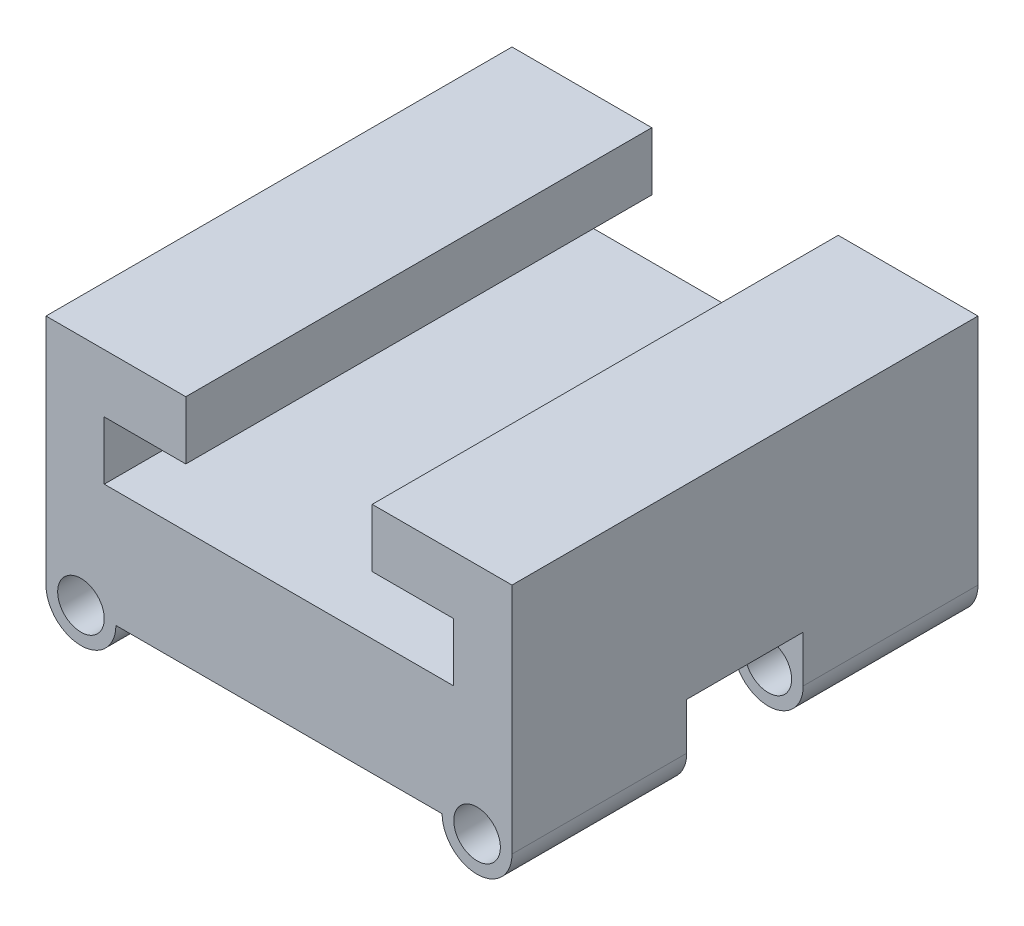
ISO-10303-21;
HEADER;
FILE_DESCRIPTION(('STEP AP214'),'2;1');
FILE_NAME('part.step','',(''),(''),'','','');
FILE_SCHEMA(('AUTOMOTIVE_DESIGN { 1 0 10303 214 1 1 1 1 }'));
ENDSEC;
DATA;
#1=APPLICATION_CONTEXT('core data for automotive mechanical design processes');
#2=APPLICATION_PROTOCOL_DEFINITION('international standard','automotive_design',2000,#1);
#3=PRODUCT_CONTEXT('',#1,'mechanical');
#4=PRODUCT('Part','Part','',(#3));
#5=PRODUCT_RELATED_PRODUCT_CATEGORY('part','',(#4));
#6=PRODUCT_DEFINITION_FORMATION('','',#4);
#7=PRODUCT_DEFINITION_CONTEXT('part definition',#1,'design');
#8=PRODUCT_DEFINITION('design','',#6,#7);
#9=PRODUCT_DEFINITION_SHAPE('','',#8);
#10=(LENGTH_UNIT() NAMED_UNIT(*) SI_UNIT(.MILLI.,.METRE.));
#11=(NAMED_UNIT(*) PLANE_ANGLE_UNIT() SI_UNIT($,.RADIAN.));
#12=(NAMED_UNIT(*) SI_UNIT($,.STERADIAN.) SOLID_ANGLE_UNIT());
#13=UNCERTAINTY_MEASURE_WITH_UNIT(LENGTH_MEASURE(1.E-05),#10,'distance_accuracy_value','');
#14=(GEOMETRIC_REPRESENTATION_CONTEXT(3) GLOBAL_UNCERTAINTY_ASSIGNED_CONTEXT((#13)) GLOBAL_UNIT_ASSIGNED_CONTEXT((#10,
#11,#12)) REPRESENTATION_CONTEXT('',''));
#15=CARTESIAN_POINT('',(0.,0.,0.));
#16=DIRECTION('',(0.,0.,1.));
#17=DIRECTION('',(1.,0.,0.));
#18=AXIS2_PLACEMENT_3D('',#15,#16,#17);
#19=CARTESIAN_POINT('',(20.,0.,40.));
#20=DIRECTION('',(0.,-1.,0.));
#21=DIRECTION('',(1.,0.,0.));
#22=AXIS2_PLACEMENT_3D('',#19,#20,#21);
#23=PLANE('',#22);
#24=DIRECTION('',(0.,0.,1.));
#25=VECTOR('',#24,1.);
#26=CARTESIAN_POINT('',(13.,0.,3.68629150101524));
#27=LINE('',#26,#25);
#28=CARTESIAN_POINT('',(13.,0.,15.));
#29=VERTEX_POINT('',#28);
#30=CARTESIAN_POINT('',(13.,0.,25.));
#31=VERTEX_POINT('',#30);
#32=EDGE_CURVE('E220',#29,#31,#27,.T.);
#33=ORIENTED_EDGE('',*,*,#32,.T.);
#34=DIRECTION('',(1.,0.,0.));
#35=VECTOR('',#34,1.);
#36=CARTESIAN_POINT('',(20.,0.,25.));
#37=LINE('',#36,#35);
#38=CARTESIAN_POINT('',(14.,0.,25.));
#39=VERTEX_POINT('',#38);
#40=EDGE_CURVE('E190',#31,#39,#37,.T.);
#41=ORIENTED_EDGE('',*,*,#40,.T.);
#42=DIRECTION('',(0.,0.,1.));
#43=VECTOR('',#42,1.);
#44=CARTESIAN_POINT('',(14.,0.,25.));
#45=LINE('',#44,#43);
#46=CARTESIAN_POINT('',(14.,0.,40.));
#47=VERTEX_POINT('',#46);
#48=EDGE_CURVE('E239',#39,#47,#45,.T.);
#49=ORIENTED_EDGE('',*,*,#48,.T.);
#50=DIRECTION('',(-1.,0.,0.));
#51=VECTOR('',#50,1.);
#52=CARTESIAN_POINT('',(20.,0.,40.));
#53=LINE('',#52,#51);
#54=CARTESIAN_POINT('',(-14.,0.,40.));
#55=VERTEX_POINT('',#54);
#56=EDGE_CURVE('E62',#47,#55,#53,.T.);
#57=ORIENTED_EDGE('',*,*,#56,.T.);
#58=DIRECTION('',(0.,0.,-1.));
#59=VECTOR('',#58,1.);
#60=CARTESIAN_POINT('',(-14.,0.,48.4852813742386));
#61=LINE('',#60,#59);
#62=CARTESIAN_POINT('',(-14.,0.,0.));
#63=VERTEX_POINT('',#62);
#64=EDGE_CURVE('E66',#63,#55,#61,.F.);
#65=ORIENTED_EDGE('',*,*,#64,.F.);
#66=DIRECTION('',(-1.,0.,0.));
#67=VECTOR('',#66,1.);
#68=CARTESIAN_POINT('',(20.,0.,0.));
#69=LINE('',#68,#67);
#70=CARTESIAN_POINT('',(14.,0.,0.));
#71=VERTEX_POINT('',#70);
#72=EDGE_CURVE('E316',#71,#63,#69,.T.);
#73=ORIENTED_EDGE('',*,*,#72,.F.);
#74=DIRECTION('',(0.,0.,-1.));
#75=VECTOR('',#74,1.);
#76=CARTESIAN_POINT('',(14.,0.,15.));
#77=LINE('',#76,#75);
#78=CARTESIAN_POINT('',(14.,0.,15.));
#79=VERTEX_POINT('',#78);
#80=EDGE_CURVE('E248',#79,#71,#77,.T.);
#81=ORIENTED_EDGE('',*,*,#80,.F.);
#82=DIRECTION('',(1.,0.,0.));
#83=VECTOR('',#82,1.);
#84=CARTESIAN_POINT('',(20.,0.,15.));
#85=LINE('',#84,#83);
#86=EDGE_CURVE('E189',#29,#79,#85,.T.);
#87=ORIENTED_EDGE('',*,*,#86,.F.);
#88=EDGE_LOOP('',(#33,#41,#49,#57,#65,#73,#81,#87));
#89=FACE_BOUND('',#88,.T.);
#90=ADVANCED_FACE('F44',(#89),#23,.T.);
#91=CARTESIAN_POINT('',(20.,20.,40.));
#92=DIRECTION('',(1.,0.,0.));
#93=DIRECTION('',(0.,1.,0.));
#94=AXIS2_PLACEMENT_3D('',#91,#92,#93);
#95=PLANE('',#94);
#96=DIRECTION('',(0.,0.,-1.));
#97=VECTOR('',#96,1.);
#98=CARTESIAN_POINT('',(20.,0.,40.));
#99=LINE('',#98,#97);
#100=CARTESIAN_POINT('',(20.,0.,40.));
#101=VERTEX_POINT('',#100);
#102=CARTESIAN_POINT('',(20.,0.,25.));
#103=VERTEX_POINT('',#102);
#104=EDGE_CURVE('E374',#101,#103,#99,.T.);
#105=ORIENTED_EDGE('',*,*,#104,.T.);
#106=DIRECTION('',(0.,-1.,0.));
#107=VECTOR('',#106,1.);
#108=CARTESIAN_POINT('',(20.,4.,25.));
#109=LINE('',#108,#107);
#110=CARTESIAN_POINT('',(20.,4.,25.));
#111=VERTEX_POINT('',#110);
#112=EDGE_CURVE('E205',#111,#103,#109,.T.);
#113=ORIENTED_EDGE('',*,*,#112,.F.);
#114=DIRECTION('',(0.,0.,1.));
#115=VECTOR('',#114,1.);
#116=CARTESIAN_POINT('',(20.,4.,3.68629150101524));
#117=LINE('',#116,#115);
#118=CARTESIAN_POINT('',(20.,4.,15.));
#119=VERTEX_POINT('',#118);
#120=EDGE_CURVE('E195',#119,#111,#117,.T.);
#121=ORIENTED_EDGE('',*,*,#120,.F.);
#122=DIRECTION('',(0.,1.,0.));
#123=VECTOR('',#122,1.);
#124=CARTESIAN_POINT('',(20.,20.,15.));
#125=LINE('',#124,#123);
#126=CARTESIAN_POINT('',(20.,0.,15.));
#127=VERTEX_POINT('',#126);
#128=EDGE_CURVE('E176',#127,#119,#125,.T.);
#129=ORIENTED_EDGE('',*,*,#128,.F.);
#130=DIRECTION('',(0.,0.,-1.));
#131=VECTOR('',#130,1.);
#132=CARTESIAN_POINT('',(20.,0.,15.));
#133=LINE('',#132,#131);
#134=CARTESIAN_POINT('',(20.,0.,0.));
#135=VERTEX_POINT('',#134);
#136=EDGE_CURVE('E251',#127,#135,#133,.T.);
#137=ORIENTED_EDGE('',*,*,#136,.T.);
#138=DIRECTION('',(0.,-1.,0.));
#139=VECTOR('',#138,1.);
#140=CARTESIAN_POINT('',(20.,20.,0.));
#141=LINE('',#140,#139);
#142=CARTESIAN_POINT('',(20.,20.,0.));
#143=VERTEX_POINT('',#142);
#144=EDGE_CURVE('E312',#143,#135,#141,.T.);
#145=ORIENTED_EDGE('',*,*,#144,.F.);
#146=DIRECTION('',(0.,0.,-1.));
#147=VECTOR('',#146,1.);
#148=CARTESIAN_POINT('',(20.,20.,40.));
#149=LINE('',#148,#147);
#150=CARTESIAN_POINT('',(20.,20.,40.));
#151=VERTEX_POINT('',#150);
#152=EDGE_CURVE('E377',#151,#143,#149,.T.);
#153=ORIENTED_EDGE('',*,*,#152,.F.);
#154=DIRECTION('',(0.,-1.,0.));
#155=VECTOR('',#154,1.);
#156=CARTESIAN_POINT('',(20.,20.,40.));
#157=LINE('',#156,#155);
#158=EDGE_CURVE('E267',#151,#101,#157,.T.);
#159=ORIENTED_EDGE('',*,*,#158,.T.);
#160=EDGE_LOOP('',(#105,#113,#121,#129,#137,#145,#153,#159));
#161=FACE_BOUND('',#160,.T.);
#162=ADVANCED_FACE('F204',(#161),#95,.T.);
#163=CARTESIAN_POINT('',(7.99999999999999,15.,40.));
#164=DIRECTION('',(-1.,0.,0.));
#165=DIRECTION('',(0.,0.,1.));
#166=AXIS2_PLACEMENT_3D('',#163,#164,#165);
#167=PLANE('',#166);
#168=DIRECTION('',(0.,1.,0.));
#169=VECTOR('',#168,1.);
#170=CARTESIAN_POINT('',(7.99999999999999,15.,0.));
#171=LINE('',#170,#169);
#172=CARTESIAN_POINT('',(7.99999999999999,15.,0.));
#173=VERTEX_POINT('',#172);
#174=CARTESIAN_POINT('',(7.99999999999999,20.,0.));
#175=VERTEX_POINT('',#174);
#176=EDGE_CURVE('E254',#173,#175,#171,.T.);
#177=ORIENTED_EDGE('',*,*,#176,.F.);
#178=DIRECTION('',(0.,0.,-1.));
#179=VECTOR('',#178,1.);
#180=CARTESIAN_POINT('',(7.99999999999999,15.,40.));
#181=LINE('',#180,#179);
#182=CARTESIAN_POINT('',(7.99999999999999,15.,40.));
#183=VERTEX_POINT('',#182);
#184=EDGE_CURVE('E11',#183,#173,#181,.T.);
#185=ORIENTED_EDGE('',*,*,#184,.F.);
#186=DIRECTION('',(0.,1.,0.));
#187=VECTOR('',#186,1.);
#188=CARTESIAN_POINT('',(7.99999999999999,15.,40.));
#189=LINE('',#188,#187);
#190=CARTESIAN_POINT('',(7.99999999999999,20.,40.));
#191=VERTEX_POINT('',#190);
#192=EDGE_CURVE('E258',#183,#191,#189,.T.);
#193=ORIENTED_EDGE('',*,*,#192,.T.);
#194=DIRECTION('',(0.,0.,-1.));
#195=VECTOR('',#194,1.);
#196=CARTESIAN_POINT('',(7.99999999999999,20.,40.));
#197=LINE('',#196,#195);
#198=EDGE_CURVE('E304',#191,#175,#197,.T.);
#199=ORIENTED_EDGE('',*,*,#198,.T.);
#200=EDGE_LOOP('',(#177,#185,#193,#199));
#201=FACE_BOUND('',#200,.T.);
#202=ADVANCED_FACE('F46',(#201),#167,.T.);
#203=CARTESIAN_POINT('',(15.,15.,40.));
#204=DIRECTION('',(0.,-1.,0.));
#205=DIRECTION('',(0.,0.,-1.));
#206=AXIS2_PLACEMENT_3D('',#203,#204,#205);
#207=PLANE('',#206);
#208=DIRECTION('',(-1.,0.,0.));
#209=VECTOR('',#208,1.);
#210=CARTESIAN_POINT('',(15.,15.,0.));
#211=LINE('',#210,#209);
#212=CARTESIAN_POINT('',(15.,15.,0.));
#213=VERTEX_POINT('',#212);
#214=EDGE_CURVE('E263',#213,#173,#211,.T.);
#215=ORIENTED_EDGE('',*,*,#214,.F.);
#216=DIRECTION('',(0.,0.,-1.));
#217=VECTOR('',#216,1.);
#218=CARTESIAN_POINT('',(15.,15.,40.));
#219=LINE('',#218,#217);
#220=CARTESIAN_POINT('',(15.,15.,40.));
#221=VERTEX_POINT('',#220);
#222=EDGE_CURVE('E54',#221,#213,#219,.T.);
#223=ORIENTED_EDGE('',*,*,#222,.F.);
#224=DIRECTION('',(-1.,0.,0.));
#225=VECTOR('',#224,1.);
#226=CARTESIAN_POINT('',(15.,15.,40.));
#227=LINE('',#226,#225);
#228=EDGE_CURVE('E300',#221,#183,#227,.T.);
#229=ORIENTED_EDGE('',*,*,#228,.T.);
#230=ORIENTED_EDGE('',*,*,#184,.T.);
#231=EDGE_LOOP('',(#215,#223,#229,#230));
#232=FACE_BOUND('',#231,.T.);
#233=ADVANCED_FACE('F393',(#232),#207,.T.);
#234=CARTESIAN_POINT('',(15.,9.99999999999999,40.));
#235=DIRECTION('',(-1.,0.,0.));
#236=DIRECTION('',(0.,-1.,0.));
#237=AXIS2_PLACEMENT_3D('',#234,#235,#236);
#238=PLANE('',#237);
#239=DIRECTION('',(0.,1.,0.));
#240=VECTOR('',#239,1.);
#241=CARTESIAN_POINT('',(15.,9.99999999999999,0.));
#242=LINE('',#241,#240);
#243=CARTESIAN_POINT('',(15.,9.99999999999999,0.));
#244=VERTEX_POINT('',#243);
#245=EDGE_CURVE('E343',#244,#213,#242,.T.);
#246=ORIENTED_EDGE('',*,*,#245,.F.);
#247=DIRECTION('',(0.,0.,-1.));
#248=VECTOR('',#247,1.);
#249=CARTESIAN_POINT('',(15.,9.99999999999999,40.));
#250=LINE('',#249,#248);
#251=CARTESIAN_POINT('',(15.,9.99999999999999,40.));
#252=VERTEX_POINT('',#251);
#253=EDGE_CURVE('E352',#252,#244,#250,.T.);
#254=ORIENTED_EDGE('',*,*,#253,.F.);
#255=DIRECTION('',(0.,1.,0.));
#256=VECTOR('',#255,1.);
#257=CARTESIAN_POINT('',(15.,9.99999999999999,40.));
#258=LINE('',#257,#256);
#259=EDGE_CURVE('E296',#252,#221,#258,.T.);
#260=ORIENTED_EDGE('',*,*,#259,.T.);
#261=ORIENTED_EDGE('',*,*,#222,.T.);
#262=EDGE_LOOP('',(#246,#254,#260,#261));
#263=FACE_BOUND('',#262,.T.);
#264=ADVANCED_FACE('F514',(#263),#238,.T.);
#265=CARTESIAN_POINT('',(-15.,9.99999999999999,40.));
#266=DIRECTION('',(0.,1.,0.));
#267=DIRECTION('',(-1.,0.,0.));
#268=AXIS2_PLACEMENT_3D('',#265,#266,#267);
#269=PLANE('',#268);
#270=DIRECTION('',(1.,0.,0.));
#271=VECTOR('',#270,1.);
#272=CARTESIAN_POINT('',(-15.,9.99999999999999,0.));
#273=LINE('',#272,#271);
#274=CARTESIAN_POINT('',(-15.,9.99999999999999,0.));
#275=VERTEX_POINT('',#274);
#276=EDGE_CURVE('E339',#275,#244,#273,.T.);
#277=ORIENTED_EDGE('',*,*,#276,.F.);
#278=DIRECTION('',(0.,0.,-1.));
#279=VECTOR('',#278,1.);
#280=CARTESIAN_POINT('',(-15.,9.99999999999999,40.));
#281=LINE('',#280,#279);
#282=CARTESIAN_POINT('',(-15.,9.99999999999999,40.));
#283=VERTEX_POINT('',#282);
#284=EDGE_CURVE('E355',#283,#275,#281,.T.);
#285=ORIENTED_EDGE('',*,*,#284,.F.);
#286=DIRECTION('',(1.,0.,0.));
#287=VECTOR('',#286,1.);
#288=CARTESIAN_POINT('',(-15.,9.99999999999999,40.));
#289=LINE('',#288,#287);
#290=EDGE_CURVE('E292',#283,#252,#289,.T.);
#291=ORIENTED_EDGE('',*,*,#290,.T.);
#292=ORIENTED_EDGE('',*,*,#253,.T.);
#293=EDGE_LOOP('',(#277,#285,#291,#292));
#294=FACE_BOUND('',#293,.T.);
#295=ADVANCED_FACE('F511',(#294),#269,.T.);
#296=CARTESIAN_POINT('',(-15.,15.,40.));
#297=DIRECTION('',(1.,0.,0.));
#298=DIRECTION('',(0.,1.,0.));
#299=AXIS2_PLACEMENT_3D('',#296,#297,#298);
#300=PLANE('',#299);
#301=DIRECTION('',(0.,-1.,0.));
#302=VECTOR('',#301,1.);
#303=CARTESIAN_POINT('',(-15.,15.,0.));
#304=LINE('',#303,#302);
#305=CARTESIAN_POINT('',(-15.,15.,0.));
#306=VERTEX_POINT('',#305);
#307=EDGE_CURVE('E335',#306,#275,#304,.T.);
#308=ORIENTED_EDGE('',*,*,#307,.F.);
#309=DIRECTION('',(0.,0.,-1.));
#310=VECTOR('',#309,1.);
#311=CARTESIAN_POINT('',(-15.,15.,40.));
#312=LINE('',#311,#310);
#313=CARTESIAN_POINT('',(-15.,15.,40.));
#314=VERTEX_POINT('',#313);
#315=EDGE_CURVE('E358',#314,#306,#312,.T.);
#316=ORIENTED_EDGE('',*,*,#315,.F.);
#317=DIRECTION('',(0.,-1.,0.));
#318=VECTOR('',#317,1.);
#319=CARTESIAN_POINT('',(-15.,15.,40.));
#320=LINE('',#319,#318);
#321=EDGE_CURVE('E288',#314,#283,#320,.T.);
#322=ORIENTED_EDGE('',*,*,#321,.T.);
#323=ORIENTED_EDGE('',*,*,#284,.T.);
#324=EDGE_LOOP('',(#308,#316,#322,#323));
#325=FACE_BOUND('',#324,.T.);
#326=ADVANCED_FACE('F508',(#325),#300,.T.);
#327=CARTESIAN_POINT('',(-8.,15.,40.));
#328=DIRECTION('',(0.,-1.,0.));
#329=DIRECTION('',(1.,0.,0.));
#330=AXIS2_PLACEMENT_3D('',#327,#328,#329);
#331=PLANE('',#330);
#332=DIRECTION('',(-1.,0.,0.));
#333=VECTOR('',#332,1.);
#334=CARTESIAN_POINT('',(-8.,15.,0.));
#335=LINE('',#334,#333);
#336=CARTESIAN_POINT('',(-8.,15.,0.));
#337=VERTEX_POINT('',#336);
#338=EDGE_CURVE('E331',#337,#306,#335,.T.);
#339=ORIENTED_EDGE('',*,*,#338,.F.);
#340=DIRECTION('',(0.,0.,-1.));
#341=VECTOR('',#340,1.);
#342=CARTESIAN_POINT('',(-8.,15.,40.));
#343=LINE('',#342,#341);
#344=CARTESIAN_POINT('',(-8.,15.,40.));
#345=VERTEX_POINT('',#344);
#346=EDGE_CURVE('E361',#345,#337,#343,.T.);
#347=ORIENTED_EDGE('',*,*,#346,.F.);
#348=DIRECTION('',(-1.,0.,0.));
#349=VECTOR('',#348,1.);
#350=CARTESIAN_POINT('',(-8.,15.,40.));
#351=LINE('',#350,#349);
#352=EDGE_CURVE('E284',#345,#314,#351,.T.);
#353=ORIENTED_EDGE('',*,*,#352,.T.);
#354=ORIENTED_EDGE('',*,*,#315,.T.);
#355=EDGE_LOOP('',(#339,#347,#353,#354));
#356=FACE_BOUND('',#355,.T.);
#357=ADVANCED_FACE('F504',(#356),#331,.T.);
#358=CARTESIAN_POINT('',(-8.,20.,40.));
#359=DIRECTION('',(1.,0.,0.));
#360=DIRECTION('',(0.,0.,-1.));
#361=AXIS2_PLACEMENT_3D('',#358,#359,#360);
#362=PLANE('',#361);
#363=DIRECTION('',(0.,-1.,0.));
#364=VECTOR('',#363,1.);
#365=CARTESIAN_POINT('',(-8.,20.,0.));
#366=LINE('',#365,#364);
#367=CARTESIAN_POINT('',(-8.,20.,0.));
#368=VERTEX_POINT('',#367);
#369=EDGE_CURVE('E327',#368,#337,#366,.T.);
#370=ORIENTED_EDGE('',*,*,#369,.F.);
#371=DIRECTION('',(0.,0.,-1.));
#372=VECTOR('',#371,1.);
#373=CARTESIAN_POINT('',(-8.,20.,40.));
#374=LINE('',#373,#372);
#375=CARTESIAN_POINT('',(-8.,20.,40.));
#376=VERTEX_POINT('',#375);
#377=EDGE_CURVE('E364',#376,#368,#374,.T.);
#378=ORIENTED_EDGE('',*,*,#377,.F.);
#379=DIRECTION('',(0.,-1.,0.));
#380=VECTOR('',#379,1.);
#381=CARTESIAN_POINT('',(-8.,20.,40.));
#382=LINE('',#381,#380);
#383=EDGE_CURVE('E280',#376,#345,#382,.T.);
#384=ORIENTED_EDGE('',*,*,#383,.T.);
#385=ORIENTED_EDGE('',*,*,#346,.T.);
#386=EDGE_LOOP('',(#370,#378,#384,#385));
#387=FACE_BOUND('',#386,.T.);
#388=ADVANCED_FACE('F488',(#387),#362,.T.);
#389=CARTESIAN_POINT('',(-20.,20.,40.));
#390=DIRECTION('',(0.,1.,0.));
#391=DIRECTION('',(0.,0.,1.));
#392=AXIS2_PLACEMENT_3D('',#389,#390,#391);
#393=PLANE('',#392);
#394=DIRECTION('',(1.,0.,0.));
#395=VECTOR('',#394,1.);
#396=CARTESIAN_POINT('',(-20.,20.,0.));
#397=LINE('',#396,#395);
#398=CARTESIAN_POINT('',(-20.,20.,0.));
#399=VERTEX_POINT('',#398);
#400=EDGE_CURVE('E323',#399,#368,#397,.T.);
#401=ORIENTED_EDGE('',*,*,#400,.F.);
#402=DIRECTION('',(0.,0.,-1.));
#403=VECTOR('',#402,1.);
#404=CARTESIAN_POINT('',(-20.,20.,40.));
#405=LINE('',#404,#403);
#406=CARTESIAN_POINT('',(-20.,20.,40.));
#407=VERTEX_POINT('',#406);
#408=EDGE_CURVE('E367',#407,#399,#405,.T.);
#409=ORIENTED_EDGE('',*,*,#408,.F.);
#410=DIRECTION('',(1.,0.,0.));
#411=VECTOR('',#410,1.);
#412=CARTESIAN_POINT('',(-20.,20.,40.));
#413=LINE('',#412,#411);
#414=EDGE_CURVE('E276',#407,#376,#413,.T.);
#415=ORIENTED_EDGE('',*,*,#414,.T.);
#416=ORIENTED_EDGE('',*,*,#377,.T.);
#417=EDGE_LOOP('',(#401,#409,#415,#416));
#418=FACE_BOUND('',#417,.T.);
#419=ADVANCED_FACE('F484',(#418),#393,.T.);
#420=CARTESIAN_POINT('',(-20.,0.,40.));
#421=DIRECTION('',(-1.,0.,0.));
#422=DIRECTION('',(0.,-1.,0.));
#423=AXIS2_PLACEMENT_3D('',#420,#421,#422);
#424=PLANE('',#423);
#425=DIRECTION('',(0.,1.,0.));
#426=VECTOR('',#425,1.);
#427=CARTESIAN_POINT('',(-20.,0.,0.));
#428=LINE('',#427,#426);
#429=CARTESIAN_POINT('',(-20.,0.,0.));
#430=VERTEX_POINT('',#429);
#431=EDGE_CURVE('E319',#430,#399,#428,.T.);
#432=ORIENTED_EDGE('',*,*,#431,.F.);
#433=DIRECTION('',(0.,0.,-1.));
#434=VECTOR('',#433,1.);
#435=CARTESIAN_POINT('',(-20.,0.,40.));
#436=LINE('',#435,#434);
#437=CARTESIAN_POINT('',(-20.,0.,40.));
#438=VERTEX_POINT('',#437);
#439=EDGE_CURVE('E370',#438,#430,#436,.T.);
#440=ORIENTED_EDGE('',*,*,#439,.F.);
#441=DIRECTION('',(0.,1.,0.));
#442=VECTOR('',#441,1.);
#443=CARTESIAN_POINT('',(-20.,0.,40.));
#444=LINE('',#443,#442);
#445=EDGE_CURVE('E272',#438,#407,#444,.T.);
#446=ORIENTED_EDGE('',*,*,#445,.T.);
#447=ORIENTED_EDGE('',*,*,#408,.T.);
#448=EDGE_LOOP('',(#432,#440,#446,#447));
#449=FACE_BOUND('',#448,.T.);
#450=ADVANCED_FACE('F474',(#449),#424,.T.);
#451=CARTESIAN_POINT('',(7.99999999999999,20.,40.));
#452=DIRECTION('',(0.,1.,0.));
#453=DIRECTION('',(0.,0.,1.));
#454=AXIS2_PLACEMENT_3D('',#451,#452,#453);
#455=PLANE('',#454);
#456=DIRECTION('',(1.,0.,0.));
#457=VECTOR('',#456,1.);
#458=CARTESIAN_POINT('',(7.99999999999999,20.,0.));
#459=LINE('',#458,#457);
#460=EDGE_CURVE('E308',#175,#143,#459,.T.);
#461=ORIENTED_EDGE('',*,*,#460,.F.);
#462=ORIENTED_EDGE('',*,*,#198,.F.);
#463=DIRECTION('',(1.,0.,0.));
#464=VECTOR('',#463,1.);
#465=CARTESIAN_POINT('',(7.99999999999999,20.,40.));
#466=LINE('',#465,#464);
#467=EDGE_CURVE('E262',#191,#151,#466,.T.);
#468=ORIENTED_EDGE('',*,*,#467,.T.);
#469=ORIENTED_EDGE('',*,*,#152,.T.);
#470=EDGE_LOOP('',(#461,#462,#468,#469));
#471=FACE_BOUND('',#470,.T.);
#472=ADVANCED_FACE('F386',(#471),#455,.T.);
#473=CARTESIAN_POINT('',(0.,0.,40.));
#474=DIRECTION('',(0.,0.,-1.));
#475=DIRECTION('',(-1.,0.,0.));
#476=AXIS2_PLACEMENT_3D('',#473,#474,#475);
#477=PLANE('',#476);
#478=CARTESIAN_POINT('',(-17.,0.,40.));
#479=DIRECTION('',(0.,0.,-1.));
#480=DIRECTION('',(-1.,0.,0.));
#481=AXIS2_PLACEMENT_3D('',#478,#479,#480);
#482=CIRCLE('',#481,1.99999999999999);
#483=CARTESIAN_POINT('',(-19.,0.,40.));
#484=VERTEX_POINT('',#483);
#485=EDGE_CURVE('E429',#484,#484,#482,.T.);
#486=ORIENTED_EDGE('',*,*,#485,.T.);
#487=EDGE_LOOP('',(#486));
#488=FACE_BOUND('',#487,.T.);
#489=CARTESIAN_POINT('',(17.,0.,40.));
#490=DIRECTION('',(0.,0.,-1.));
#491=DIRECTION('',(-1.,0.,0.));
#492=AXIS2_PLACEMENT_3D('',#489,#490,#491);
#493=CIRCLE('',#492,1.99999999999999);
#494=CARTESIAN_POINT('',(15.,0.,40.));
#495=VERTEX_POINT('',#494);
#496=EDGE_CURVE('E422',#495,#495,#493,.T.);
#497=ORIENTED_EDGE('',*,*,#496,.T.);
#498=EDGE_LOOP('',(#497));
#499=FACE_BOUND('',#498,.T.);
#500=ORIENTED_EDGE('',*,*,#445,.F.);
#501=CARTESIAN_POINT('',(-17.,0.,40.));
#502=DIRECTION('',(0.,0.,-1.));
#503=DIRECTION('',(-1.,0.,0.));
#504=AXIS2_PLACEMENT_3D('',#501,#502,#503);
#505=CIRCLE('',#504,3.);
#506=EDGE_CURVE('E228',#438,#55,#505,.F.);
#507=ORIENTED_EDGE('',*,*,#506,.T.);
#508=ORIENTED_EDGE('',*,*,#56,.F.);
#509=CARTESIAN_POINT('',(17.,0.,40.));
#510=DIRECTION('',(0.,0.,-1.));
#511=DIRECTION('',(-1.,0.,0.));
#512=AXIS2_PLACEMENT_3D('',#509,#510,#511);
#513=CIRCLE('',#512,3.);
#514=EDGE_CURVE('E234',#101,#47,#513,.T.);
#515=ORIENTED_EDGE('',*,*,#514,.F.);
#516=ORIENTED_EDGE('',*,*,#158,.F.);
#517=ORIENTED_EDGE('',*,*,#467,.F.);
#518=ORIENTED_EDGE('',*,*,#192,.F.);
#519=ORIENTED_EDGE('',*,*,#228,.F.);
#520=ORIENTED_EDGE('',*,*,#259,.F.);
#521=ORIENTED_EDGE('',*,*,#290,.F.);
#522=ORIENTED_EDGE('',*,*,#321,.F.);
#523=ORIENTED_EDGE('',*,*,#352,.F.);
#524=ORIENTED_EDGE('',*,*,#383,.F.);
#525=ORIENTED_EDGE('',*,*,#414,.F.);
#526=EDGE_LOOP('',(#500,#507,#508,#515,#516,#517,#518,#519,#520,#521,#522,#523,#524,#525));
#527=FACE_BOUND('',#526,.T.);
#528=ADVANCED_FACE('F397',(#488,#499,#527),#477,.F.);
#529=CARTESIAN_POINT('',(0.,0.,0.));
#530=DIRECTION('',(0.,0.,-1.));
#531=DIRECTION('',(-1.,0.,0.));
#532=AXIS2_PLACEMENT_3D('',#529,#530,#531);
#533=PLANE('',#532);
#534=CARTESIAN_POINT('',(-17.,0.,0.));
#535=DIRECTION('',(0.,0.,-1.));
#536=DIRECTION('',(-1.,0.,0.));
#537=AXIS2_PLACEMENT_3D('',#534,#535,#536);
#538=CIRCLE('',#537,1.99999999999999);
#539=CARTESIAN_POINT('',(-19.,0.,0.));
#540=VERTEX_POINT('',#539);
#541=EDGE_CURVE('E433',#540,#540,#538,.T.);
#542=ORIENTED_EDGE('',*,*,#541,.F.);
#543=EDGE_LOOP('',(#542));
#544=FACE_BOUND('',#543,.T.);
#545=CARTESIAN_POINT('',(17.,0.,0.));
#546=DIRECTION('',(0.,0.,-1.));
#547=DIRECTION('',(-1.,0.,0.));
#548=AXIS2_PLACEMENT_3D('',#545,#546,#547);
#549=CIRCLE('',#548,1.99999999999999);
#550=CARTESIAN_POINT('',(15.,0.,0.));
#551=VERTEX_POINT('',#550);
#552=EDGE_CURVE('E425',#551,#551,#549,.T.);
#553=ORIENTED_EDGE('',*,*,#552,.F.);
#554=EDGE_LOOP('',(#553));
#555=FACE_BOUND('',#554,.T.);
#556=ORIENTED_EDGE('',*,*,#72,.T.);
#557=CARTESIAN_POINT('',(-17.,0.,0.));
#558=DIRECTION('',(0.,0.,-1.));
#559=DIRECTION('',(-1.,0.,0.));
#560=AXIS2_PLACEMENT_3D('',#557,#558,#559);
#561=CIRCLE('',#560,3.);
#562=EDGE_CURVE('E224',#63,#430,#561,.T.);
#563=ORIENTED_EDGE('',*,*,#562,.T.);
#564=ORIENTED_EDGE('',*,*,#431,.T.);
#565=ORIENTED_EDGE('',*,*,#400,.T.);
#566=ORIENTED_EDGE('',*,*,#369,.T.);
#567=ORIENTED_EDGE('',*,*,#338,.T.);
#568=ORIENTED_EDGE('',*,*,#307,.T.);
#569=ORIENTED_EDGE('',*,*,#276,.T.);
#570=ORIENTED_EDGE('',*,*,#245,.T.);
#571=ORIENTED_EDGE('',*,*,#214,.T.);
#572=ORIENTED_EDGE('',*,*,#176,.T.);
#573=ORIENTED_EDGE('',*,*,#460,.T.);
#574=ORIENTED_EDGE('',*,*,#144,.T.);
#575=CARTESIAN_POINT('',(17.,0.,0.));
#576=DIRECTION('',(0.,0.,-1.));
#577=DIRECTION('',(-1.,0.,0.));
#578=AXIS2_PLACEMENT_3D('',#575,#576,#577);
#579=CIRCLE('',#578,3.);
#580=EDGE_CURVE('E245',#135,#71,#579,.T.);
#581=ORIENTED_EDGE('',*,*,#580,.T.);
#582=EDGE_LOOP('',(#556,#563,#564,#565,#566,#567,#568,#569,#570,#571,#572,#573,#574,#581));
#583=FACE_BOUND('',#582,.T.);
#584=ADVANCED_FACE('F389',(#544,#555,#583),#533,.T.);
#585=CARTESIAN_POINT('',(17.,0.,15.));
#586=DIRECTION('',(0.,0.,-1.));
#587=DIRECTION('',(-1.,0.,0.));
#588=AXIS2_PLACEMENT_3D('',#585,#586,#587);
#589=CYLINDRICAL_SURFACE('',#588,3.);
#590=ORIENTED_EDGE('',*,*,#580,.F.);
#591=ORIENTED_EDGE('',*,*,#136,.F.);
#592=CARTESIAN_POINT('',(17.,0.,15.));
#593=DIRECTION('',(0.,0.,-1.));
#594=DIRECTION('',(-1.,0.,0.));
#595=AXIS2_PLACEMENT_3D('',#592,#593,#594);
#596=CIRCLE('',#595,3.);
#597=EDGE_CURVE('E183',#127,#79,#596,.T.);
#598=ORIENTED_EDGE('',*,*,#597,.T.);
#599=ORIENTED_EDGE('',*,*,#80,.T.);
#600=EDGE_LOOP('',(#590,#591,#598,#599));
#601=FACE_BOUND('',#600,.T.);
#602=ADVANCED_FACE('F444',(#601),#589,.T.);
#603=CARTESIAN_POINT('',(17.,0.,15.));
#604=DIRECTION('',(0.,0.,-1.));
#605=DIRECTION('',(-1.,0.,0.));
#606=AXIS2_PLACEMENT_3D('',#603,#604,#605);
#607=PLANE('',#606);
#608=CARTESIAN_POINT('',(17.,0.,15.));
#609=DIRECTION('',(0.,0.,-1.));
#610=DIRECTION('',(-1.,0.,0.));
#611=AXIS2_PLACEMENT_3D('',#608,#609,#610);
#612=CIRCLE('',#611,1.99999999999999);
#613=CARTESIAN_POINT('',(15.,0.,15.));
#614=VERTEX_POINT('',#613);
#615=EDGE_CURVE('E48',#614,#614,#612,.T.);
#616=ORIENTED_EDGE('',*,*,#615,.T.);
#617=EDGE_LOOP('',(#616));
#618=FACE_BOUND('',#617,.T.);
#619=ORIENTED_EDGE('',*,*,#597,.F.);
#620=ORIENTED_EDGE('',*,*,#128,.T.);
#621=DIRECTION('',(1.,0.,0.));
#622=VECTOR('',#621,1.);
#623=CARTESIAN_POINT('',(17.,4.,15.));
#624=LINE('',#623,#622);
#625=CARTESIAN_POINT('',(17.,4.,15.));
#626=VERTEX_POINT('',#625);
#627=EDGE_CURVE('E180',#626,#119,#624,.T.);
#628=ORIENTED_EDGE('',*,*,#627,.F.);
#629=CARTESIAN_POINT('',(17.,0.,15.));
#630=DIRECTION('',(0.,0.,-1.));
#631=DIRECTION('',(-1.,0.,0.));
#632=AXIS2_PLACEMENT_3D('',#629,#630,#631);
#633=CIRCLE('',#632,4.);
#634=EDGE_CURVE('E200',#29,#626,#633,.T.);
#635=ORIENTED_EDGE('',*,*,#634,.F.);
#636=ORIENTED_EDGE('',*,*,#86,.T.);
#637=EDGE_LOOP('',(#619,#620,#628,#635,#636));
#638=FACE_BOUND('',#637,.T.);
#639=ADVANCED_FACE('F178',(#618,#638),#607,.F.);
#640=CARTESIAN_POINT('',(17.,0.,25.));
#641=DIRECTION('',(0.,0.,1.));
#642=DIRECTION('',(1.,0.,0.));
#643=AXIS2_PLACEMENT_3D('',#640,#641,#642);
#644=CYLINDRICAL_SURFACE('',#643,3.);
#645=ORIENTED_EDGE('',*,*,#514,.T.);
#646=ORIENTED_EDGE('',*,*,#48,.F.);
#647=CARTESIAN_POINT('',(17.,0.,25.));
#648=DIRECTION('',(0.,0.,-1.));
#649=DIRECTION('',(-1.,0.,0.));
#650=AXIS2_PLACEMENT_3D('',#647,#648,#649);
#651=CIRCLE('',#650,3.);
#652=EDGE_CURVE('E235',#103,#39,#651,.T.);
#653=ORIENTED_EDGE('',*,*,#652,.F.);
#654=ORIENTED_EDGE('',*,*,#104,.F.);
#655=EDGE_LOOP('',(#645,#646,#653,#654));
#656=FACE_BOUND('',#655,.T.);
#657=ADVANCED_FACE('F404',(#656),#644,.T.);
#658=CARTESIAN_POINT('',(17.,0.,25.));
#659=DIRECTION('',(0.,0.,1.));
#660=DIRECTION('',(-1.,0.,0.));
#661=AXIS2_PLACEMENT_3D('',#658,#659,#660);
#662=PLANE('',#661);
#663=CARTESIAN_POINT('',(17.,0.,25.));
#664=DIRECTION('',(0.,0.,1.));
#665=DIRECTION('',(1.,0.,0.));
#666=AXIS2_PLACEMENT_3D('',#663,#664,#665);
#667=CIRCLE('',#666,1.99999999999999);
#668=CARTESIAN_POINT('',(19.,0.,25.));
#669=VERTEX_POINT('',#668);
#670=EDGE_CURVE('E412',#669,#669,#667,.T.);
#671=ORIENTED_EDGE('',*,*,#670,.T.);
#672=EDGE_LOOP('',(#671));
#673=FACE_BOUND('',#672,.T.);
#674=ORIENTED_EDGE('',*,*,#652,.T.);
#675=ORIENTED_EDGE('',*,*,#40,.F.);
#676=CARTESIAN_POINT('',(17.,0.,25.));
#677=DIRECTION('',(0.,0.,-1.));
#678=DIRECTION('',(-1.,0.,0.));
#679=AXIS2_PLACEMENT_3D('',#676,#677,#678);
#680=CIRCLE('',#679,4.);
#681=CARTESIAN_POINT('',(17.,4.,25.));
#682=VERTEX_POINT('',#681);
#683=EDGE_CURVE('E409',#31,#682,#680,.T.);
#684=ORIENTED_EDGE('',*,*,#683,.T.);
#685=DIRECTION('',(1.,0.,0.));
#686=VECTOR('',#685,1.);
#687=CARTESIAN_POINT('',(17.,4.,25.));
#688=LINE('',#687,#686);
#689=EDGE_CURVE('E207',#682,#111,#688,.T.);
#690=ORIENTED_EDGE('',*,*,#689,.T.);
#691=ORIENTED_EDGE('',*,*,#112,.T.);
#692=EDGE_LOOP('',(#674,#675,#684,#690,#691));
#693=FACE_BOUND('',#692,.T.);
#694=ADVANCED_FACE('F407',(#673,#693),#662,.F.);
#695=CARTESIAN_POINT('',(-17.,0.,48.4852813742386));
#696=DIRECTION('',(0.,0.,-1.));
#697=DIRECTION('',(-1.,0.,0.));
#698=AXIS2_PLACEMENT_3D('',#695,#696,#697);
#699=CYLINDRICAL_SURFACE('',#698,3.);
#700=ORIENTED_EDGE('',*,*,#562,.F.);
#701=ORIENTED_EDGE('',*,*,#64,.T.);
#702=ORIENTED_EDGE('',*,*,#506,.F.);
#703=ORIENTED_EDGE('',*,*,#439,.T.);
#704=EDGE_LOOP('',(#700,#701,#702,#703));
#705=FACE_BOUND('',#704,.T.);
#706=ADVANCED_FACE('F494',(#705),#699,.T.);
#707=CARTESIAN_POINT('',(17.,0.,3.68629150101524));
#708=DIRECTION('',(0.,0.,1.));
#709=DIRECTION('',(1.,0.,0.));
#710=AXIS2_PLACEMENT_3D('',#707,#708,#709);
#711=CYLINDRICAL_SURFACE('',#710,4.);
#712=ORIENTED_EDGE('',*,*,#634,.T.);
#713=DIRECTION('',(0.,0.,1.));
#714=VECTOR('',#713,1.);
#715=CARTESIAN_POINT('',(17.,4.,3.68629150101524));
#716=LINE('',#715,#714);
#717=EDGE_CURVE('E198',#626,#682,#716,.T.);
#718=ORIENTED_EDGE('',*,*,#717,.T.);
#719=ORIENTED_EDGE('',*,*,#683,.F.);
#720=ORIENTED_EDGE('',*,*,#32,.F.);
#721=EDGE_LOOP('',(#712,#718,#719,#720));
#722=FACE_BOUND('',#721,.T.);
#723=ADVANCED_FACE('F414',(#722),#711,.F.);
#724=CARTESIAN_POINT('',(17.,4.,3.68629150101524));
#725=DIRECTION('',(0.,-1.,0.));
#726=DIRECTION('',(1.,0.,0.));
#727=AXIS2_PLACEMENT_3D('',#724,#725,#726);
#728=PLANE('',#727);
#729=ORIENTED_EDGE('',*,*,#627,.T.);
#730=ORIENTED_EDGE('',*,*,#120,.T.);
#731=ORIENTED_EDGE('',*,*,#689,.F.);
#732=ORIENTED_EDGE('',*,*,#717,.F.);
#733=EDGE_LOOP('',(#729,#730,#731,#732));
#734=FACE_BOUND('',#733,.T.);
#735=ADVANCED_FACE('F193',(#734),#728,.T.);
#736=CARTESIAN_POINT('',(17.,0.,0.));
#737=DIRECTION('',(0.,0.,-1.));
#738=DIRECTION('',(-1.,0.,0.));
#739=AXIS2_PLACEMENT_3D('',#736,#737,#738);
#740=CYLINDRICAL_SURFACE('',#739,1.99999999999999);
#741=ORIENTED_EDGE('',*,*,#552,.T.);
#742=EDGE_LOOP('',(#741));
#743=FACE_BOUND('',#742,.T.);
#744=ORIENTED_EDGE('',*,*,#615,.F.);
#745=EDGE_LOOP('',(#744));
#746=FACE_BOUND('',#745,.T.);
#747=ADVANCED_FACE('F448',(#743,#746),#740,.F.);
#748=ORIENTED_EDGE('',*,*,#496,.F.);
#749=EDGE_LOOP('',(#748));
#750=FACE_BOUND('',#749,.T.);
#751=ORIENTED_EDGE('',*,*,#670,.F.);
#752=EDGE_LOOP('',(#751));
#753=FACE_BOUND('',#752,.T.);
#754=ADVANCED_FACE('F451',(#750,#753),#740,.F.);
#755=CARTESIAN_POINT('',(-17.,0.,0.));
#756=DIRECTION('',(0.,0.,-1.));
#757=DIRECTION('',(-1.,0.,0.));
#758=AXIS2_PLACEMENT_3D('',#755,#756,#757);
#759=CYLINDRICAL_SURFACE('',#758,1.99999999999999);
#760=ORIENTED_EDGE('',*,*,#485,.F.);
#761=EDGE_LOOP('',(#760));
#762=FACE_BOUND('',#761,.T.);
#763=ORIENTED_EDGE('',*,*,#541,.T.);
#764=EDGE_LOOP('',(#763));
#765=FACE_BOUND('',#764,.T.);
#766=ADVANCED_FACE('F440',(#762,#765),#759,.F.);
#767=CLOSED_SHELL('',(#90,#162,#202,#233,#264,#295,#326,#357,#388,#419,#450,#472,#528,#584,#602,
#639,#657,#694,#706,#723,#735,#747,#754,#766));
#768=MANIFOLD_SOLID_BREP('B2',#767);
#769=ADVANCED_BREP_SHAPE_REPRESENTATION('',(#18,#768),#14);
#770=SHAPE_DEFINITION_REPRESENTATION(#9,#769);
ENDSEC;
END-ISO-10303-21;
